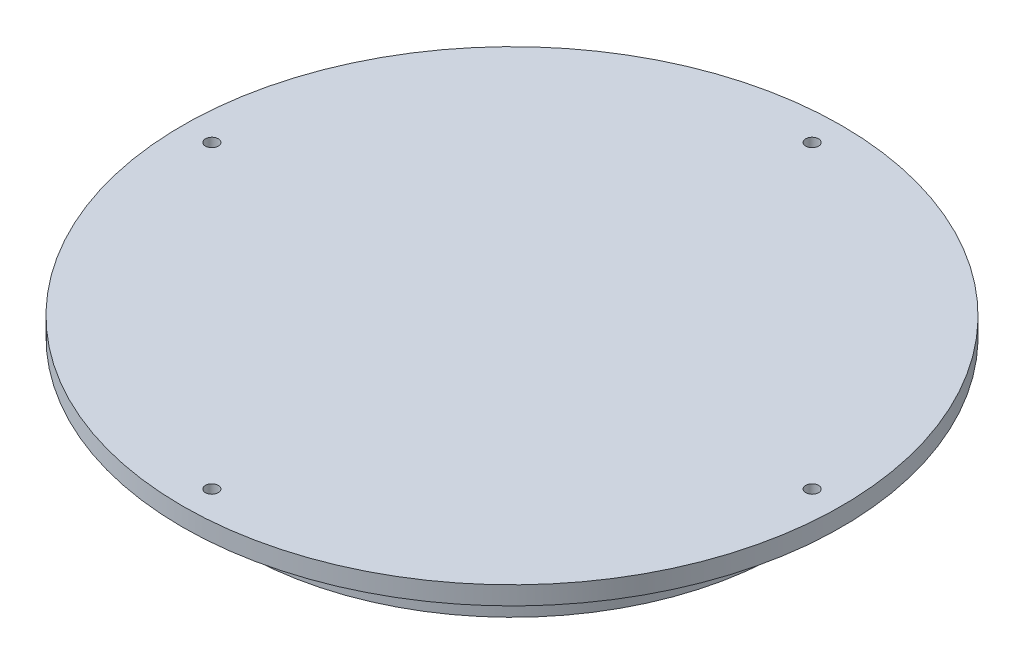
ISO-10303-21;
HEADER;
FILE_DESCRIPTION(('STEP AP214'),'2;1');
FILE_NAME('part.step','',(''),(''),'','','');
FILE_SCHEMA(('AUTOMOTIVE_DESIGN { 1 0 10303 214 1 1 1 1 }'));
ENDSEC;
DATA;
#1=APPLICATION_CONTEXT('core data for automotive mechanical design processes');
#2=APPLICATION_PROTOCOL_DEFINITION('international standard','automotive_design',2000,#1);
#3=PRODUCT_CONTEXT('',#1,'mechanical');
#4=PRODUCT('Part','Part','',(#3));
#5=PRODUCT_RELATED_PRODUCT_CATEGORY('part','',(#4));
#6=PRODUCT_DEFINITION_FORMATION('','',#4);
#7=PRODUCT_DEFINITION_CONTEXT('part definition',#1,'design');
#8=PRODUCT_DEFINITION('design','',#6,#7);
#9=PRODUCT_DEFINITION_SHAPE('','',#8);
#10=(LENGTH_UNIT() NAMED_UNIT(*) SI_UNIT(.MILLI.,.METRE.));
#11=(NAMED_UNIT(*) PLANE_ANGLE_UNIT() SI_UNIT($,.RADIAN.));
#12=(NAMED_UNIT(*) SI_UNIT($,.STERADIAN.) SOLID_ANGLE_UNIT());
#13=UNCERTAINTY_MEASURE_WITH_UNIT(LENGTH_MEASURE(1.E-05),#10,'distance_accuracy_value','');
#14=(GEOMETRIC_REPRESENTATION_CONTEXT(3) GLOBAL_UNCERTAINTY_ASSIGNED_CONTEXT((#13)) GLOBAL_UNIT_ASSIGNED_CONTEXT((#10,
#11,#12)) REPRESENTATION_CONTEXT('',''));
#15=CARTESIAN_POINT('',(0.,0.,0.));
#16=DIRECTION('',(0.,0.,1.));
#17=DIRECTION('',(1.,0.,0.));
#18=AXIS2_PLACEMENT_3D('',#15,#16,#17);
#19=CARTESIAN_POINT('',(0.,2.,63.5));
#20=DIRECTION('',(-1.,0.,0.));
#21=DIRECTION('',(0.,0.,1.));
#22=AXIS2_PLACEMENT_3D('',#19,#20,#21);
#23=CYLINDRICAL_SURFACE('',#22,2.);
#24=CARTESIAN_POINT('',(-3.,2.,63.5));
#25=DIRECTION('',(-0.707106781186547,0.707106781186547,0.));
#26=DIRECTION('',(-0.707106781186547,-0.707106781186547,0.));
#27=AXIS2_PLACEMENT_3D('',#24,#25,#26);
#28=ELLIPSE('',#27,2.82842712474619,2.);
#29=CARTESIAN_POINT('',(-5.,0.,63.5));
#30=VERTEX_POINT('',#29);
#31=CARTESIAN_POINT('',(-4.,1.,61.7679491924311));
#32=VERTEX_POINT('',#31);
#33=EDGE_CURVE('E375',#30,#32,#28,.F.);
#34=ORIENTED_EDGE('',*,*,#33,.T.);
#35=DIRECTION('',(1.,0.,0.));
#36=VECTOR('',#35,1.);
#37=CARTESIAN_POINT('',(5.,1.,61.7679491924311));
#38=LINE('',#37,#36);
#39=CARTESIAN_POINT('',(3.99999999999999,1.,61.7679491924311));
#40=VERTEX_POINT('',#39);
#41=EDGE_CURVE('E62',#32,#40,#38,.T.);
#42=ORIENTED_EDGE('',*,*,#41,.T.);
#43=CARTESIAN_POINT('',(3.,2.,63.5));
#44=DIRECTION('',(-0.707106781186547,-0.707106781186547,0.));
#45=DIRECTION('',(-0.707106781186547,0.707106781186547,0.));
#46=AXIS2_PLACEMENT_3D('',#43,#44,#45);
#47=ELLIPSE('',#46,2.82842712474619,2.);
#48=CARTESIAN_POINT('',(5.,0.,63.5));
#49=VERTEX_POINT('',#48);
#50=EDGE_CURVE('E368',#49,#40,#47,.F.);
#51=ORIENTED_EDGE('',*,*,#50,.F.);
#52=DIRECTION('',(1.,0.,0.));
#53=VECTOR('',#52,1.);
#54=CARTESIAN_POINT('',(5.,0.,63.5));
#55=LINE('',#54,#53);
#56=EDGE_CURVE('E276',#30,#49,#55,.T.);
#57=ORIENTED_EDGE('',*,*,#56,.F.);
#58=EDGE_LOOP('',(#34,#42,#51,#57));
#59=FACE_BOUND('',#58,.T.);
#60=ADVANCED_FACE('F44',(#59),#23,.T.);
#61=CARTESIAN_POINT('',(-3.,2.,63.5));
#62=DIRECTION('',(0.,-1.,0.));
#63=DIRECTION('',(0.,0.,-1.));
#64=AXIS2_PLACEMENT_3D('',#61,#62,#63);
#65=CYLINDRICAL_SURFACE('',#64,2.);
#66=CARTESIAN_POINT('',(-3.,0.,63.5));
#67=DIRECTION('',(-0.707106781186547,-0.707106781186547,0.));
#68=DIRECTION('',(0.707106781186547,-0.707106781186547,0.));
#69=AXIS2_PLACEMENT_3D('',#66,#67,#68);
#70=ELLIPSE('',#69,2.82842712474619,2.);
#71=CARTESIAN_POINT('',(-5.,2.,63.5));
#72=VERTEX_POINT('',#71);
#73=EDGE_CURVE('E358',#32,#72,#70,.F.);
#74=ORIENTED_EDGE('',*,*,#73,.F.);
#75=ORIENTED_EDGE('',*,*,#33,.F.);
#76=DIRECTION('',(0.,-1.,0.));
#77=VECTOR('',#76,1.);
#78=CARTESIAN_POINT('',(-5.,2.,63.5));
#79=LINE('',#78,#77);
#80=EDGE_CURVE('E317',#72,#30,#79,.T.);
#81=ORIENTED_EDGE('',*,*,#80,.F.);
#82=EDGE_LOOP('',(#74,#75,#81));
#83=FACE_BOUND('',#82,.T.);
#84=ADVANCED_FACE('F46',(#83),#65,.T.);
#85=CARTESIAN_POINT('',(5.,0.,63.5));
#86=DIRECTION('',(1.,0.,0.));
#87=DIRECTION('',(0.,0.,-1.));
#88=AXIS2_PLACEMENT_3D('',#85,#86,#87);
#89=CYLINDRICAL_SURFACE('',#88,2.);
#90=ORIENTED_EDGE('',*,*,#41,.F.);
#91=ORIENTED_EDGE('',*,*,#73,.T.);
#92=DIRECTION('',(1.,0.,0.));
#93=VECTOR('',#92,1.);
#94=CARTESIAN_POINT('',(0.,2.,63.5));
#95=LINE('',#94,#93);
#96=CARTESIAN_POINT('',(5.,2.,63.5));
#97=VERTEX_POINT('',#96);
#98=EDGE_CURVE('E314',#97,#72,#95,.F.);
#99=ORIENTED_EDGE('',*,*,#98,.F.);
#100=CARTESIAN_POINT('',(3.,0.,63.5));
#101=DIRECTION('',(0.707106781186547,-0.707106781186547,0.));
#102=DIRECTION('',(0.707106781186547,0.707106781186547,0.));
#103=AXIS2_PLACEMENT_3D('',#100,#101,#102);
#104=ELLIPSE('',#103,2.82842712474619,2.);
#105=EDGE_CURVE('E372',#40,#97,#104,.T.);
#106=ORIENTED_EDGE('',*,*,#105,.F.);
#107=EDGE_LOOP('',(#90,#91,#99,#106));
#108=FACE_BOUND('',#107,.T.);
#109=ADVANCED_FACE('F536',(#108),#89,.T.);
#110=CARTESIAN_POINT('',(3.,2.,63.5));
#111=DIRECTION('',(0.,-1.,0.));
#112=DIRECTION('',(0.,0.,-1.));
#113=AXIS2_PLACEMENT_3D('',#110,#111,#112);
#114=CYLINDRICAL_SURFACE('',#113,2.);
#115=ORIENTED_EDGE('',*,*,#50,.T.);
#116=ORIENTED_EDGE('',*,*,#105,.T.);
#117=DIRECTION('',(0.,-1.,0.));
#118=VECTOR('',#117,1.);
#119=CARTESIAN_POINT('',(5.,2.,63.5));
#120=LINE('',#119,#118);
#121=EDGE_CURVE('E310',#49,#97,#120,.F.);
#122=ORIENTED_EDGE('',*,*,#121,.F.);
#123=EDGE_LOOP('',(#115,#116,#122));
#124=FACE_BOUND('',#123,.T.);
#125=ADVANCED_FACE('F539',(#124),#114,.T.);
#126=CARTESIAN_POINT('',(-63.5,2.,0.));
#127=DIRECTION('',(0.,0.,-1.));
#128=DIRECTION('',(-1.,0.,0.));
#129=AXIS2_PLACEMENT_3D('',#126,#127,#128);
#130=CYLINDRICAL_SURFACE('',#129,2.);
#131=CARTESIAN_POINT('',(-63.5,2.,-3.));
#132=DIRECTION('',(0.,0.707106781186547,-0.707106781186547));
#133=DIRECTION('',(0.,-0.707106781186547,-0.707106781186547));
#134=AXIS2_PLACEMENT_3D('',#131,#132,#133);
#135=ELLIPSE('',#134,2.82842712474619,2.);
#136=CARTESIAN_POINT('',(-63.5,0.,-5.));
#137=VERTEX_POINT('',#136);
#138=CARTESIAN_POINT('',(-61.7679491924311,1.,-4.));
#139=VERTEX_POINT('',#138);
#140=EDGE_CURVE('E361',#137,#139,#135,.F.);
#141=ORIENTED_EDGE('',*,*,#140,.T.);
#142=DIRECTION('',(0.,0.,1.));
#143=VECTOR('',#142,1.);
#144=CARTESIAN_POINT('',(-61.7679491924311,1.,5.));
#145=LINE('',#144,#143);
#146=CARTESIAN_POINT('',(-61.7679491924311,1.,4.));
#147=VERTEX_POINT('',#146);
#148=EDGE_CURVE('E382',#139,#147,#145,.T.);
#149=ORIENTED_EDGE('',*,*,#148,.T.);
#150=CARTESIAN_POINT('',(-63.5,2.,3.));
#151=DIRECTION('',(0.,-0.707106781186547,-0.707106781186547));
#152=DIRECTION('',(0.,0.707106781186547,-0.707106781186547));
#153=AXIS2_PLACEMENT_3D('',#150,#151,#152);
#154=ELLIPSE('',#153,2.82842712474619,2.);
#155=CARTESIAN_POINT('',(-63.5,0.,5.));
#156=VERTEX_POINT('',#155);
#157=EDGE_CURVE('E353',#156,#147,#154,.F.);
#158=ORIENTED_EDGE('',*,*,#157,.F.);
#159=DIRECTION('',(0.,0.,1.));
#160=VECTOR('',#159,1.);
#161=CARTESIAN_POINT('',(-63.5,0.,5.));
#162=LINE('',#161,#160);
#163=EDGE_CURVE('E279',#137,#156,#162,.T.);
#164=ORIENTED_EDGE('',*,*,#163,.F.);
#165=EDGE_LOOP('',(#141,#149,#158,#164));
#166=FACE_BOUND('',#165,.T.);
#167=ADVANCED_FACE('F545',(#166),#130,.T.);
#168=CARTESIAN_POINT('',(-63.5,2.,-3.));
#169=DIRECTION('',(0.,-1.,0.));
#170=DIRECTION('',(0.,0.,-1.));
#171=AXIS2_PLACEMENT_3D('',#168,#169,#170);
#172=CYLINDRICAL_SURFACE('',#171,2.);
#173=CARTESIAN_POINT('',(-63.5,0.,-3.));
#174=DIRECTION('',(0.,-0.707106781186547,-0.707106781186547));
#175=DIRECTION('',(0.,-0.707106781186547,0.707106781186547));
#176=AXIS2_PLACEMENT_3D('',#173,#174,#175);
#177=ELLIPSE('',#176,2.82842712474619,2.);
#178=CARTESIAN_POINT('',(-63.5,2.,-5.));
#179=VERTEX_POINT('',#178);
#180=EDGE_CURVE('E343',#139,#179,#177,.F.);
#181=ORIENTED_EDGE('',*,*,#180,.F.);
#182=ORIENTED_EDGE('',*,*,#140,.F.);
#183=DIRECTION('',(0.,-1.,0.));
#184=VECTOR('',#183,1.);
#185=CARTESIAN_POINT('',(-63.5,2.,-5.));
#186=LINE('',#185,#184);
#187=EDGE_CURVE('E306',#179,#137,#186,.T.);
#188=ORIENTED_EDGE('',*,*,#187,.F.);
#189=EDGE_LOOP('',(#181,#182,#188));
#190=FACE_BOUND('',#189,.T.);
#191=ADVANCED_FACE('F550',(#190),#172,.T.);
#192=CARTESIAN_POINT('',(-63.5,0.,5.));
#193=DIRECTION('',(0.,0.,-1.));
#194=DIRECTION('',(-1.,0.,0.));
#195=AXIS2_PLACEMENT_3D('',#192,#193,#194);
#196=CYLINDRICAL_SURFACE('',#195,2.);
#197=ORIENTED_EDGE('',*,*,#148,.F.);
#198=ORIENTED_EDGE('',*,*,#180,.T.);
#199=DIRECTION('',(0.,0.,1.));
#200=VECTOR('',#199,1.);
#201=CARTESIAN_POINT('',(-63.5,2.,-5.));
#202=LINE('',#201,#200);
#203=CARTESIAN_POINT('',(-63.5,2.,5.));
#204=VERTEX_POINT('',#203);
#205=EDGE_CURVE('E303',#204,#179,#202,.F.);
#206=ORIENTED_EDGE('',*,*,#205,.F.);
#207=CARTESIAN_POINT('',(-63.5,0.,3.));
#208=DIRECTION('',(0.,0.707106781186547,-0.707106781186547));
#209=DIRECTION('',(0.,-0.707106781186547,-0.707106781186547));
#210=AXIS2_PLACEMENT_3D('',#207,#208,#209);
#211=ELLIPSE('',#210,2.82842712474619,2.);
#212=EDGE_CURVE('E357',#147,#204,#211,.F.);
#213=ORIENTED_EDGE('',*,*,#212,.F.);
#214=EDGE_LOOP('',(#197,#198,#206,#213));
#215=FACE_BOUND('',#214,.T.);
#216=ADVANCED_FACE('F602',(#215),#196,.T.);
#217=CARTESIAN_POINT('',(-63.5,2.,3.));
#218=DIRECTION('',(0.,-1.,0.));
#219=DIRECTION('',(0.,0.,-1.));
#220=AXIS2_PLACEMENT_3D('',#217,#218,#219);
#221=CYLINDRICAL_SURFACE('',#220,2.);
#222=ORIENTED_EDGE('',*,*,#157,.T.);
#223=ORIENTED_EDGE('',*,*,#212,.T.);
#224=DIRECTION('',(0.,-1.,0.));
#225=VECTOR('',#224,1.);
#226=CARTESIAN_POINT('',(-63.5,2.,5.));
#227=LINE('',#226,#225);
#228=EDGE_CURVE('E299',#156,#204,#227,.F.);
#229=ORIENTED_EDGE('',*,*,#228,.F.);
#230=EDGE_LOOP('',(#222,#223,#229));
#231=FACE_BOUND('',#230,.T.);
#232=ADVANCED_FACE('F600',(#231),#221,.T.);
#233=CARTESIAN_POINT('',(63.5,2.,0.));
#234=DIRECTION('',(0.,0.,1.));
#235=DIRECTION('',(1.,0.,0.));
#236=AXIS2_PLACEMENT_3D('',#233,#234,#235);
#237=CYLINDRICAL_SURFACE('',#236,2.);
#238=CARTESIAN_POINT('',(63.5,2.,3.00000000000001));
#239=DIRECTION('',(0.,0.707106781186547,0.707106781186547));
#240=DIRECTION('',(0.,-0.707106781186547,0.707106781186547));
#241=AXIS2_PLACEMENT_3D('',#238,#239,#240);
#242=ELLIPSE('',#241,2.82842712474619,2.);
#243=CARTESIAN_POINT('',(63.5,0.,5.00000000000001));
#244=VERTEX_POINT('',#243);
#245=CARTESIAN_POINT('',(61.7679491924311,1.,4.00000000000001));
#246=VERTEX_POINT('',#245);
#247=EDGE_CURVE('E346',#244,#246,#242,.F.);
#248=ORIENTED_EDGE('',*,*,#247,.T.);
#249=DIRECTION('',(0.,0.,-1.));
#250=VECTOR('',#249,1.);
#251=CARTESIAN_POINT('',(61.7679491924311,1.,-4.99999999999999));
#252=LINE('',#251,#250);
#253=CARTESIAN_POINT('',(61.7679491924311,1.,-3.99999999999999));
#254=VERTEX_POINT('',#253);
#255=EDGE_CURVE('E54',#246,#254,#252,.T.);
#256=ORIENTED_EDGE('',*,*,#255,.T.);
#257=CARTESIAN_POINT('',(63.5,2.,-2.99999999999999));
#258=DIRECTION('',(0.,-0.707106781186547,0.707106781186547));
#259=DIRECTION('',(0.,0.707106781186547,0.707106781186547));
#260=AXIS2_PLACEMENT_3D('',#257,#258,#259);
#261=ELLIPSE('',#260,2.82842712474619,2.);
#262=CARTESIAN_POINT('',(63.5,0.,-4.99999999999999));
#263=VERTEX_POINT('',#262);
#264=EDGE_CURVE('E338',#263,#254,#261,.F.);
#265=ORIENTED_EDGE('',*,*,#264,.F.);
#266=DIRECTION('',(0.,0.,-1.));
#267=VECTOR('',#266,1.);
#268=CARTESIAN_POINT('',(63.5,0.,-4.99999999999999));
#269=LINE('',#268,#267);
#270=EDGE_CURVE('E282',#244,#263,#269,.T.);
#271=ORIENTED_EDGE('',*,*,#270,.F.);
#272=EDGE_LOOP('',(#248,#256,#265,#271));
#273=FACE_BOUND('',#272,.T.);
#274=ADVANCED_FACE('F570',(#273),#237,.T.);
#275=CARTESIAN_POINT('',(63.5,2.,3.00000000000001));
#276=DIRECTION('',(0.,-1.,0.));
#277=DIRECTION('',(0.,0.,-1.));
#278=AXIS2_PLACEMENT_3D('',#275,#276,#277);
#279=CYLINDRICAL_SURFACE('',#278,2.);
#280=CARTESIAN_POINT('',(63.5,0.,3.00000000000001));
#281=DIRECTION('',(0.,-0.707106781186547,0.707106781186547));
#282=DIRECTION('',(0.,-0.707106781186547,-0.707106781186547));
#283=AXIS2_PLACEMENT_3D('',#280,#281,#282);
#284=ELLIPSE('',#283,2.82842712474619,2.);
#285=CARTESIAN_POINT('',(63.5,2.,5.00000000000001));
#286=VERTEX_POINT('',#285);
#287=EDGE_CURVE('E326',#246,#286,#284,.F.);
#288=ORIENTED_EDGE('',*,*,#287,.F.);
#289=ORIENTED_EDGE('',*,*,#247,.F.);
#290=DIRECTION('',(0.,-1.,0.));
#291=VECTOR('',#290,1.);
#292=CARTESIAN_POINT('',(63.5,2.,5.00000000000001));
#293=LINE('',#292,#291);
#294=EDGE_CURVE('E295',#286,#244,#293,.T.);
#295=ORIENTED_EDGE('',*,*,#294,.F.);
#296=EDGE_LOOP('',(#288,#289,#295));
#297=FACE_BOUND('',#296,.T.);
#298=ADVANCED_FACE('F586',(#297),#279,.T.);
#299=CARTESIAN_POINT('',(63.5,0.,-4.99999999999999));
#300=DIRECTION('',(0.,0.,-1.));
#301=DIRECTION('',(-1.,0.,0.));
#302=AXIS2_PLACEMENT_3D('',#299,#300,#301);
#303=CYLINDRICAL_SURFACE('',#302,2.);
#304=ORIENTED_EDGE('',*,*,#255,.F.);
#305=ORIENTED_EDGE('',*,*,#287,.T.);
#306=DIRECTION('',(0.,0.,-1.));
#307=VECTOR('',#306,1.);
#308=CARTESIAN_POINT('',(63.5,2.,0.));
#309=LINE('',#308,#307);
#310=CARTESIAN_POINT('',(63.5,2.,-4.99999999999999));
#311=VERTEX_POINT('',#310);
#312=EDGE_CURVE('E292',#311,#286,#309,.F.);
#313=ORIENTED_EDGE('',*,*,#312,.F.);
#314=CARTESIAN_POINT('',(63.5,0.,-2.99999999999999));
#315=DIRECTION('',(0.,-0.707106781186547,-0.707106781186547));
#316=DIRECTION('',(0.,0.707106781186547,-0.707106781186547));
#317=AXIS2_PLACEMENT_3D('',#314,#315,#316);
#318=ELLIPSE('',#317,2.82842712474619,2.);
#319=EDGE_CURVE('E342',#254,#311,#318,.T.);
#320=ORIENTED_EDGE('',*,*,#319,.F.);
#321=EDGE_LOOP('',(#304,#305,#313,#320));
#322=FACE_BOUND('',#321,.T.);
#323=ADVANCED_FACE('F588',(#322),#303,.T.);
#324=CARTESIAN_POINT('',(63.5,2.,-2.99999999999999));
#325=DIRECTION('',(0.,-1.,0.));
#326=DIRECTION('',(0.,0.,-1.));
#327=AXIS2_PLACEMENT_3D('',#324,#325,#326);
#328=CYLINDRICAL_SURFACE('',#327,2.);
#329=ORIENTED_EDGE('',*,*,#264,.T.);
#330=ORIENTED_EDGE('',*,*,#319,.T.);
#331=DIRECTION('',(0.,-1.,0.));
#332=VECTOR('',#331,1.);
#333=CARTESIAN_POINT('',(63.5,2.,-4.99999999999999));
#334=LINE('',#333,#332);
#335=EDGE_CURVE('E288',#263,#311,#334,.F.);
#336=ORIENTED_EDGE('',*,*,#335,.F.);
#337=EDGE_LOOP('',(#329,#330,#336));
#338=FACE_BOUND('',#337,.T.);
#339=ADVANCED_FACE('F575',(#338),#328,.T.);
#340=CARTESIAN_POINT('',(0.,2.,-63.5));
#341=DIRECTION('',(1.,0.,0.));
#342=DIRECTION('',(0.,0.,-1.));
#343=AXIS2_PLACEMENT_3D('',#340,#341,#342);
#344=CYLINDRICAL_SURFACE('',#343,2.);
#345=CARTESIAN_POINT('',(3.00000000000001,2.,-63.5));
#346=DIRECTION('',(0.707106781186547,0.707106781186547,0.));
#347=DIRECTION('',(0.707106781186547,-0.707106781186547,0.));
#348=AXIS2_PLACEMENT_3D('',#345,#346,#347);
#349=ELLIPSE('',#348,2.82842712474619,2.);
#350=CARTESIAN_POINT('',(5.00000000000001,0.,-63.5));
#351=VERTEX_POINT('',#350);
#352=CARTESIAN_POINT('',(4.00000000000001,1.,-61.7679491924311));
#353=VERTEX_POINT('',#352);
#354=EDGE_CURVE('E329',#351,#353,#349,.F.);
#355=ORIENTED_EDGE('',*,*,#354,.T.);
#356=DIRECTION('',(-1.,0.,0.));
#357=VECTOR('',#356,1.);
#358=CARTESIAN_POINT('',(-4.99999999999999,1.,-61.7679491924311));
#359=LINE('',#358,#357);
#360=CARTESIAN_POINT('',(-3.99999999999999,1.,-61.7679491924311));
#361=VERTEX_POINT('',#360);
#362=EDGE_CURVE('E11',#353,#361,#359,.T.);
#363=ORIENTED_EDGE('',*,*,#362,.T.);
#364=CARTESIAN_POINT('',(-2.99999999999999,2.,-63.5));
#365=DIRECTION('',(0.707106781186547,-0.707106781186547,0.));
#366=DIRECTION('',(0.707106781186547,0.707106781186547,0.));
#367=AXIS2_PLACEMENT_3D('',#364,#365,#366);
#368=ELLIPSE('',#367,2.82842712474619,2.);
#369=CARTESIAN_POINT('',(-4.99999999999999,0.,-63.5));
#370=VERTEX_POINT('',#369);
#371=EDGE_CURVE('E321',#370,#361,#368,.F.);
#372=ORIENTED_EDGE('',*,*,#371,.F.);
#373=DIRECTION('',(-1.,0.,0.));
#374=VECTOR('',#373,1.);
#375=CARTESIAN_POINT('',(-4.99999999999999,0.,-63.5));
#376=LINE('',#375,#374);
#377=EDGE_CURVE('E285',#351,#370,#376,.T.);
#378=ORIENTED_EDGE('',*,*,#377,.F.);
#379=EDGE_LOOP('',(#355,#363,#372,#378));
#380=FACE_BOUND('',#379,.T.);
#381=ADVANCED_FACE('F595',(#380),#344,.T.);
#382=CARTESIAN_POINT('',(3.00000000000001,2.,-63.5));
#383=DIRECTION('',(0.,-1.,0.));
#384=DIRECTION('',(0.,0.,-1.));
#385=AXIS2_PLACEMENT_3D('',#382,#383,#384);
#386=CYLINDRICAL_SURFACE('',#385,2.);
#387=CARTESIAN_POINT('',(3.00000000000001,0.,-63.5));
#388=DIRECTION('',(0.707106781186547,-0.707106781186547,0.));
#389=DIRECTION('',(-0.707106781186547,-0.707106781186547,0.));
#390=AXIS2_PLACEMENT_3D('',#387,#388,#389);
#391=ELLIPSE('',#390,2.82842712474619,2.);
#392=CARTESIAN_POINT('',(5.00000000000001,2.,-63.5));
#393=VERTEX_POINT('',#392);
#394=EDGE_CURVE('E333',#353,#393,#391,.F.);
#395=ORIENTED_EDGE('',*,*,#394,.F.);
#396=ORIENTED_EDGE('',*,*,#354,.F.);
#397=DIRECTION('',(0.,-1.,0.));
#398=VECTOR('',#397,1.);
#399=CARTESIAN_POINT('',(5.00000000000001,2.,-63.5));
#400=LINE('',#399,#398);
#401=EDGE_CURVE('E189',#393,#351,#400,.T.);
#402=ORIENTED_EDGE('',*,*,#401,.F.);
#403=EDGE_LOOP('',(#395,#396,#402));
#404=FACE_BOUND('',#403,.T.);
#405=ADVANCED_FACE('F663',(#404),#386,.T.);
#406=CARTESIAN_POINT('',(-4.99999999999999,0.,-63.5));
#407=DIRECTION('',(-1.,0.,0.));
#408=DIRECTION('',(0.,0.,1.));
#409=AXIS2_PLACEMENT_3D('',#406,#407,#408);
#410=CYLINDRICAL_SURFACE('',#409,2.);
#411=ORIENTED_EDGE('',*,*,#362,.F.);
#412=ORIENTED_EDGE('',*,*,#394,.T.);
#413=DIRECTION('',(-1.,0.,0.));
#414=VECTOR('',#413,1.);
#415=CARTESIAN_POINT('',(0.,2.,-63.5));
#416=LINE('',#415,#414);
#417=CARTESIAN_POINT('',(-4.99999999999999,2.,-63.5));
#418=VERTEX_POINT('',#417);
#419=EDGE_CURVE('E271',#418,#393,#416,.F.);
#420=ORIENTED_EDGE('',*,*,#419,.F.);
#421=CARTESIAN_POINT('',(-2.99999999999999,0.,-63.5));
#422=DIRECTION('',(-0.707106781186547,-0.707106781186547,0.));
#423=DIRECTION('',(-0.707106781186547,0.707106781186547,0.));
#424=AXIS2_PLACEMENT_3D('',#421,#422,#423);
#425=ELLIPSE('',#424,2.82842712474619,2.);
#426=EDGE_CURVE('E325',#361,#418,#425,.T.);
#427=ORIENTED_EDGE('',*,*,#426,.F.);
#428=EDGE_LOOP('',(#411,#412,#420,#427));
#429=FACE_BOUND('',#428,.T.);
#430=ADVANCED_FACE('F657',(#429),#410,.T.);
#431=CARTESIAN_POINT('',(-2.99999999999999,2.,-63.5));
#432=DIRECTION('',(0.,-1.,0.));
#433=DIRECTION('',(0.,0.,-1.));
#434=AXIS2_PLACEMENT_3D('',#431,#432,#433);
#435=CYLINDRICAL_SURFACE('',#434,2.);
#436=ORIENTED_EDGE('',*,*,#371,.T.);
#437=ORIENTED_EDGE('',*,*,#426,.T.);
#438=DIRECTION('',(0.,-1.,0.));
#439=VECTOR('',#438,1.);
#440=CARTESIAN_POINT('',(-4.99999999999999,2.,-63.5));
#441=LINE('',#440,#439);
#442=EDGE_CURVE('E208',#370,#418,#441,.F.);
#443=ORIENTED_EDGE('',*,*,#442,.F.);
#444=EDGE_LOOP('',(#436,#437,#443));
#445=FACE_BOUND('',#444,.T.);
#446=ADVANCED_FACE('F652',(#445),#435,.T.);
#447=CARTESIAN_POINT('',(0.,0.,0.));
#448=DIRECTION('',(0.,1.,0.));
#449=DIRECTION('',(0.,0.,1.));
#450=AXIS2_PLACEMENT_3D('',#447,#448,#449);
#451=PLANE('',#450);
#452=DIRECTION('',(0.,0.,1.));
#453=VECTOR('',#452,1.);
#454=CARTESIAN_POINT('',(5.00000000000001,0.,-66.5));
#455=LINE('',#454,#453);
#456=CARTESIAN_POINT('',(5.00000000000001,0.,-63.8043885637971));
#457=VERTEX_POINT('',#456);
#458=EDGE_CURVE('E182',#457,#351,#455,.T.);
#459=ORIENTED_EDGE('',*,*,#458,.T.);
#460=ORIENTED_EDGE('',*,*,#377,.T.);
#461=DIRECTION('',(0.,0.,-1.));
#462=VECTOR('',#461,1.);
#463=CARTESIAN_POINT('',(-4.99999999999999,0.,-66.5));
#464=LINE('',#463,#462);
#465=CARTESIAN_POINT('',(-4.99999999999999,0.,-63.8043885637971));
#466=VERTEX_POINT('',#465);
#467=EDGE_CURVE('E195',#370,#466,#464,.T.);
#468=ORIENTED_EDGE('',*,*,#467,.T.);
#469=CARTESIAN_POINT('',(0.,0.,0.));
#470=DIRECTION('',(0.,1.,0.));
#471=DIRECTION('',(0.,0.,1.));
#472=AXIS2_PLACEMENT_3D('',#469,#470,#471);
#473=CIRCLE('',#472,64.);
#474=CARTESIAN_POINT('',(-63.8043885637971,0.,-5.));
#475=VERTEX_POINT('',#474);
#476=EDGE_CURVE('E218',#466,#475,#473,.T.);
#477=ORIENTED_EDGE('',*,*,#476,.T.);
#478=DIRECTION('',(1.,0.,0.));
#479=VECTOR('',#478,1.);
#480=CARTESIAN_POINT('',(-66.5,0.,-5.));
#481=LINE('',#480,#479);
#482=EDGE_CURVE('E442',#475,#137,#481,.T.);
#483=ORIENTED_EDGE('',*,*,#482,.T.);
#484=ORIENTED_EDGE('',*,*,#163,.T.);
#485=DIRECTION('',(-1.,0.,0.));
#486=VECTOR('',#485,1.);
#487=CARTESIAN_POINT('',(-66.5,0.,5.));
#488=LINE('',#487,#486);
#489=CARTESIAN_POINT('',(-63.8043885637971,0.,5.));
#490=VERTEX_POINT('',#489);
#491=EDGE_CURVE('E447',#156,#490,#488,.T.);
#492=ORIENTED_EDGE('',*,*,#491,.T.);
#493=CARTESIAN_POINT('',(-5.00000000000001,0.,63.8043885637971));
#494=VERTEX_POINT('',#493);
#495=EDGE_CURVE('E224',#490,#494,#473,.T.);
#496=ORIENTED_EDGE('',*,*,#495,.T.);
#497=DIRECTION('',(0.,0.,-1.));
#498=VECTOR('',#497,1.);
#499=CARTESIAN_POINT('',(-5.00000000000001,0.,66.5));
#500=LINE('',#499,#498);
#501=EDGE_CURVE('E450',#494,#30,#500,.T.);
#502=ORIENTED_EDGE('',*,*,#501,.T.);
#503=ORIENTED_EDGE('',*,*,#56,.T.);
#504=DIRECTION('',(0.,0.,1.));
#505=VECTOR('',#504,1.);
#506=CARTESIAN_POINT('',(4.99999999999999,0.,66.5));
#507=LINE('',#506,#505);
#508=CARTESIAN_POINT('',(4.99999999999999,0.,63.8043885637971));
#509=VERTEX_POINT('',#508);
#510=EDGE_CURVE('E460',#49,#509,#507,.T.);
#511=ORIENTED_EDGE('',*,*,#510,.T.);
#512=CARTESIAN_POINT('',(63.8043885637971,0.,5.00000000000001));
#513=VERTEX_POINT('',#512);
#514=EDGE_CURVE('E217',#509,#513,#473,.T.);
#515=ORIENTED_EDGE('',*,*,#514,.T.);
#516=DIRECTION('',(-1.,0.,0.));
#517=VECTOR('',#516,1.);
#518=CARTESIAN_POINT('',(66.5,0.,5.00000000000001));
#519=LINE('',#518,#517);
#520=EDGE_CURVE('E464',#513,#244,#519,.T.);
#521=ORIENTED_EDGE('',*,*,#520,.T.);
#522=ORIENTED_EDGE('',*,*,#270,.T.);
#523=DIRECTION('',(1.,0.,0.));
#524=VECTOR('',#523,1.);
#525=CARTESIAN_POINT('',(66.5,0.,-4.99999999999999));
#526=LINE('',#525,#524);
#527=CARTESIAN_POINT('',(63.8043885637971,0.,-4.99999999999999));
#528=VERTEX_POINT('',#527);
#529=EDGE_CURVE('E214',#263,#528,#526,.T.);
#530=ORIENTED_EDGE('',*,*,#529,.T.);
#531=EDGE_CURVE('E203',#528,#457,#473,.T.);
#532=ORIENTED_EDGE('',*,*,#531,.T.);
#533=EDGE_LOOP('',(#459,#460,#468,#477,#483,#484,#492,#496,#502,#503,#511,#515,#521,#522,#530,#532));
#534=FACE_BOUND('',#533,.T.);
#535=CARTESIAN_POINT('',(0.,0.,0.));
#536=DIRECTION('',(0.,-1.,0.));
#537=DIRECTION('',(0.,0.,-1.));
#538=AXIS2_PLACEMENT_3D('',#535,#536,#537);
#539=CIRCLE('',#538,74.);
#540=CARTESIAN_POINT('',(0.,0.,-74.));
#541=VERTEX_POINT('',#540);
#542=EDGE_CURVE('E434',#541,#541,#539,.T.);
#543=ORIENTED_EDGE('',*,*,#542,.T.);
#544=EDGE_LOOP('',(#543));
#545=FACE_BOUND('',#544,.T.);
#546=ADVANCED_FACE('F211',(#534,#545),#451,.F.);
#547=CARTESIAN_POINT('',(0.,18.,0.));
#548=DIRECTION('',(0.,-1.,0.));
#549=DIRECTION('',(0.,0.,-1.));
#550=AXIS2_PLACEMENT_3D('',#547,#548,#549);
#551=CYLINDRICAL_SURFACE('',#550,64.);
#552=DIRECTION('',(0.,-1.,0.));
#553=VECTOR('',#552,1.);
#554=CARTESIAN_POINT('',(5.00000000000001,18.,-63.8043885637971));
#555=LINE('',#554,#553);
#556=CARTESIAN_POINT('',(5.00000000000001,2.,-63.8043885637971));
#557=VERTEX_POINT('',#556);
#558=EDGE_CURVE('E186',#457,#557,#555,.F.);
#559=ORIENTED_EDGE('',*,*,#558,.F.);
#560=ORIENTED_EDGE('',*,*,#531,.F.);
#561=DIRECTION('',(0.,-1.,0.));
#562=VECTOR('',#561,1.);
#563=CARTESIAN_POINT('',(63.8043885637971,18.,-4.99999999999999));
#564=LINE('',#563,#562);
#565=CARTESIAN_POINT('',(63.8043885637971,2.,-4.99999999999999));
#566=VERTEX_POINT('',#565);
#567=EDGE_CURVE('E257',#566,#528,#564,.T.);
#568=ORIENTED_EDGE('',*,*,#567,.F.);
#569=CARTESIAN_POINT('',(0.,2.,0.));
#570=DIRECTION('',(0.,1.,0.));
#571=DIRECTION('',(0.,0.,1.));
#572=AXIS2_PLACEMENT_3D('',#569,#570,#571);
#573=CIRCLE('',#572,64.);
#574=CARTESIAN_POINT('',(63.8043885637971,2.,5.00000000000001));
#575=VERTEX_POINT('',#574);
#576=EDGE_CURVE('E253',#575,#566,#573,.T.);
#577=ORIENTED_EDGE('',*,*,#576,.F.);
#578=DIRECTION('',(0.,-1.,0.));
#579=VECTOR('',#578,1.);
#580=CARTESIAN_POINT('',(63.8043885637971,18.,5.00000000000001));
#581=LINE('',#580,#579);
#582=EDGE_CURVE('E260',#513,#575,#581,.F.);
#583=ORIENTED_EDGE('',*,*,#582,.F.);
#584=ORIENTED_EDGE('',*,*,#514,.F.);
#585=DIRECTION('',(0.,-1.,0.));
#586=VECTOR('',#585,1.);
#587=CARTESIAN_POINT('',(4.99999999999999,18.,63.8043885637971));
#588=LINE('',#587,#586);
#589=CARTESIAN_POINT('',(4.99999999999999,2.,63.8043885637971));
#590=VERTEX_POINT('',#589);
#591=EDGE_CURVE('E246',#590,#509,#588,.T.);
#592=ORIENTED_EDGE('',*,*,#591,.F.);
#593=CARTESIAN_POINT('',(0.,2.,0.));
#594=DIRECTION('',(0.,1.,0.));
#595=DIRECTION('',(0.,0.,1.));
#596=AXIS2_PLACEMENT_3D('',#593,#594,#595);
#597=CIRCLE('',#596,64.);
#598=CARTESIAN_POINT('',(-5.00000000000001,2.,63.8043885637971));
#599=VERTEX_POINT('',#598);
#600=EDGE_CURVE('E242',#599,#590,#597,.T.);
#601=ORIENTED_EDGE('',*,*,#600,.F.);
#602=DIRECTION('',(0.,-1.,0.));
#603=VECTOR('',#602,1.);
#604=CARTESIAN_POINT('',(-5.00000000000001,18.,63.8043885637971));
#605=LINE('',#604,#603);
#606=EDGE_CURVE('E250',#494,#599,#605,.F.);
#607=ORIENTED_EDGE('',*,*,#606,.F.);
#608=ORIENTED_EDGE('',*,*,#495,.F.);
#609=DIRECTION('',(0.,-1.,0.));
#610=VECTOR('',#609,1.);
#611=CARTESIAN_POINT('',(-63.8043885637971,18.,5.));
#612=LINE('',#611,#610);
#613=CARTESIAN_POINT('',(-63.8043885637971,2.,5.));
#614=VERTEX_POINT('',#613);
#615=EDGE_CURVE('E235',#614,#490,#612,.T.);
#616=ORIENTED_EDGE('',*,*,#615,.F.);
#617=CARTESIAN_POINT('',(0.,2.,0.));
#618=DIRECTION('',(0.,-1.,0.));
#619=DIRECTION('',(0.,0.,-1.));
#620=AXIS2_PLACEMENT_3D('',#617,#618,#619);
#621=CIRCLE('',#620,64.);
#622=CARTESIAN_POINT('',(-63.8043885637971,2.,-5.));
#623=VERTEX_POINT('',#622);
#624=EDGE_CURVE('E230',#614,#623,#621,.T.);
#625=ORIENTED_EDGE('',*,*,#624,.T.);
#626=DIRECTION('',(0.,-1.,0.));
#627=VECTOR('',#626,1.);
#628=CARTESIAN_POINT('',(-63.8043885637971,18.,-5.));
#629=LINE('',#628,#627);
#630=EDGE_CURVE('E239',#475,#623,#629,.F.);
#631=ORIENTED_EDGE('',*,*,#630,.F.);
#632=ORIENTED_EDGE('',*,*,#476,.F.);
#633=DIRECTION('',(0.,-1.,0.));
#634=VECTOR('',#633,1.);
#635=CARTESIAN_POINT('',(-4.99999999999999,18.,-63.8043885637971));
#636=LINE('',#635,#634);
#637=CARTESIAN_POINT('',(-4.99999999999999,2.,-63.8043885637971));
#638=VERTEX_POINT('',#637);
#639=EDGE_CURVE('E209',#638,#466,#636,.T.);
#640=ORIENTED_EDGE('',*,*,#639,.F.);
#641=CARTESIAN_POINT('',(0.,2.,0.));
#642=DIRECTION('',(0.,1.,0.));
#643=DIRECTION('',(0.,0.,1.));
#644=AXIS2_PLACEMENT_3D('',#641,#642,#643);
#645=CIRCLE('',#644,64.);
#646=EDGE_CURVE('E206',#557,#638,#645,.T.);
#647=ORIENTED_EDGE('',*,*,#646,.F.);
#648=EDGE_LOOP('',(#559,#560,#568,#577,#583,#584,#592,#601,#607,#608,#616,#625,#631,#632,#640,#647));
#649=FACE_BOUND('',#648,.T.);
#650=CARTESIAN_POINT('',(0.,18.,0.));
#651=DIRECTION('',(0.,1.,0.));
#652=DIRECTION('',(0.,0.,1.));
#653=AXIS2_PLACEMENT_3D('',#650,#651,#652);
#654=CIRCLE('',#653,64.);
#655=CARTESIAN_POINT('',(0.,18.,64.));
#656=VERTEX_POINT('',#655);
#657=EDGE_CURVE('E225',#656,#656,#654,.T.);
#658=ORIENTED_EDGE('',*,*,#657,.T.);
#659=EDGE_LOOP('',(#658));
#660=FACE_BOUND('',#659,.T.);
#661=ADVANCED_FACE('F200',(#649,#660),#551,.F.);
#662=CARTESIAN_POINT('',(0.,18.,0.));
#663=DIRECTION('',(0.,1.,0.));
#664=DIRECTION('',(0.,0.,1.));
#665=AXIS2_PLACEMENT_3D('',#662,#663,#664);
#666=PLANE('',#665);
#667=ORIENTED_EDGE('',*,*,#657,.F.);
#668=EDGE_LOOP('',(#667));
#669=FACE_BOUND('',#668,.T.);
#670=ADVANCED_FACE('F508',(#669),#666,.F.);
#671=CARTESIAN_POINT('',(0.,14.,0.));
#672=DIRECTION('',(0.,-1.,0.));
#673=DIRECTION('',(0.,0.,-1.));
#674=AXIS2_PLACEMENT_3D('',#671,#672,#673);
#675=PLANE('',#674);
#676=CARTESIAN_POINT('',(0.,14.,81.9693458494063));
#677=DIRECTION('',(0.,-1.,0.));
#678=DIRECTION('',(0.,0.,-1.));
#679=AXIS2_PLACEMENT_3D('',#676,#677,#678);
#680=CIRCLE('',#679,1.75);
#681=CARTESIAN_POINT('',(0.,14.,80.2193458494063));
#682=VERTEX_POINT('',#681);
#683=EDGE_CURVE('E392',#682,#682,#680,.T.);
#684=ORIENTED_EDGE('',*,*,#683,.F.);
#685=EDGE_LOOP('',(#684));
#686=FACE_BOUND('',#685,.T.);
#687=CARTESIAN_POINT('',(81.9693458494086,14.,2.31465140537872E-12));
#688=DIRECTION('',(0.,-1.,0.));
#689=DIRECTION('',(0.,0.,-1.));
#690=AXIS2_PLACEMENT_3D('',#687,#688,#689);
#691=CIRCLE('',#690,1.75000000000181);
#692=CARTESIAN_POINT('',(81.9693458494086,14.,-1.74999999999949));
#693=VERTEX_POINT('',#692);
#694=EDGE_CURVE('E496',#693,#693,#691,.T.);
#695=ORIENTED_EDGE('',*,*,#694,.F.);
#696=EDGE_LOOP('',(#695));
#697=FACE_BOUND('',#696,.T.);
#698=CARTESIAN_POINT('',(4.62930281075743E-12,14.,-81.9693458494063));
#699=DIRECTION('',(0.,-1.,0.));
#700=DIRECTION('',(0.,0.,-1.));
#701=AXIS2_PLACEMENT_3D('',#698,#699,#700);
#702=CIRCLE('',#701,1.75000000000497);
#703=CARTESIAN_POINT('',(4.62930281075743E-12,14.,-83.7193458494112));
#704=VERTEX_POINT('',#703);
#705=EDGE_CURVE('E492',#704,#704,#702,.T.);
#706=ORIENTED_EDGE('',*,*,#705,.F.);
#707=EDGE_LOOP('',(#706));
#708=FACE_BOUND('',#707,.T.);
#709=CARTESIAN_POINT('',(-81.969345849404,14.,-2.32468975508098E-12));
#710=DIRECTION('',(0.,-1.,0.));
#711=DIRECTION('',(0.,0.,-1.));
#712=AXIS2_PLACEMENT_3D('',#709,#710,#711);
#713=CIRCLE('',#712,1.75000000000372);
#714=CARTESIAN_POINT('',(-81.969345849404,14.,-1.75000000000604));
#715=VERTEX_POINT('',#714);
#716=EDGE_CURVE('E488',#715,#715,#713,.T.);
#717=ORIENTED_EDGE('',*,*,#716,.F.);
#718=EDGE_LOOP('',(#717));
#719=FACE_BOUND('',#718,.T.);
#720=CARTESIAN_POINT('',(0.,14.,0.));
#721=DIRECTION('',(0.,-1.,0.));
#722=DIRECTION('',(0.,0.,-1.));
#723=AXIS2_PLACEMENT_3D('',#720,#721,#722);
#724=CIRCLE('',#723,74.);
#725=CARTESIAN_POINT('',(0.,14.,-74.));
#726=VERTEX_POINT('',#725);
#727=EDGE_CURVE('E431',#726,#726,#724,.T.);
#728=ORIENTED_EDGE('',*,*,#727,.F.);
#729=EDGE_LOOP('',(#728));
#730=FACE_BOUND('',#729,.T.);
#731=CARTESIAN_POINT('',(0.,14.,0.));
#732=DIRECTION('',(0.,-1.,0.));
#733=DIRECTION('',(0.,0.,-1.));
#734=AXIS2_PLACEMENT_3D('',#731,#732,#733);
#735=CIRCLE('',#734,90.);
#736=CARTESIAN_POINT('',(0.,14.,-90.));
#737=VERTEX_POINT('',#736);
#738=EDGE_CURVE('E425',#737,#737,#735,.T.);
#739=ORIENTED_EDGE('',*,*,#738,.T.);
#740=EDGE_LOOP('',(#739));
#741=FACE_BOUND('',#740,.T.);
#742=ADVANCED_FACE('F505',(#686,#697,#708,#719,#730,#741),#675,.T.);
#743=CARTESIAN_POINT('',(0.,14.,0.));
#744=DIRECTION('',(0.,-1.,0.));
#745=DIRECTION('',(0.,0.,-1.));
#746=AXIS2_PLACEMENT_3D('',#743,#744,#745);
#747=CYLINDRICAL_SURFACE('',#746,74.);
#748=ORIENTED_EDGE('',*,*,#727,.T.);
#749=EDGE_LOOP('',(#748));
#750=FACE_BOUND('',#749,.T.);
#751=ORIENTED_EDGE('',*,*,#542,.F.);
#752=EDGE_LOOP('',(#751));
#753=FACE_BOUND('',#752,.T.);
#754=ADVANCED_FACE('F413',(#750,#753),#747,.T.);
#755=CARTESIAN_POINT('',(0.,19.,0.));
#756=DIRECTION('',(0.,1.,0.));
#757=DIRECTION('',(0.,0.,1.));
#758=AXIS2_PLACEMENT_3D('',#755,#756,#757);
#759=PLANE('',#758);
#760=CARTESIAN_POINT('',(0.,19.,81.9693458494063));
#761=DIRECTION('',(0.,1.,0.));
#762=DIRECTION('',(0.,0.,1.));
#763=AXIS2_PLACEMENT_3D('',#760,#761,#762);
#764=CIRCLE('',#763,1.75);
#765=CARTESIAN_POINT('',(0.,19.,83.7193458494063));
#766=VERTEX_POINT('',#765);
#767=EDGE_CURVE('E48',#766,#766,#764,.T.);
#768=ORIENTED_EDGE('',*,*,#767,.F.);
#769=EDGE_LOOP('',(#768));
#770=FACE_BOUND('',#769,.T.);
#771=CARTESIAN_POINT('',(81.9693458494086,19.,2.31465140537872E-12));
#772=DIRECTION('',(0.,1.,0.));
#773=DIRECTION('',(0.,0.,1.));
#774=AXIS2_PLACEMENT_3D('',#771,#772,#773);
#775=CIRCLE('',#774,1.75000000000181);
#776=CARTESIAN_POINT('',(81.9693458494086,19.,1.75000000000412));
#777=VERTEX_POINT('',#776);
#778=EDGE_CURVE('E395',#777,#777,#775,.T.);
#779=ORIENTED_EDGE('',*,*,#778,.F.);
#780=EDGE_LOOP('',(#779));
#781=FACE_BOUND('',#780,.T.);
#782=CARTESIAN_POINT('',(4.62930281075743E-12,19.,-81.9693458494063));
#783=DIRECTION('',(0.,1.,0.));
#784=DIRECTION('',(0.,0.,1.));
#785=AXIS2_PLACEMENT_3D('',#782,#783,#784);
#786=CIRCLE('',#785,1.75000000000497);
#787=CARTESIAN_POINT('',(4.62930281075743E-12,19.,-80.2193458494013));
#788=VERTEX_POINT('',#787);
#789=EDGE_CURVE('E391',#788,#788,#786,.T.);
#790=ORIENTED_EDGE('',*,*,#789,.F.);
#791=EDGE_LOOP('',(#790));
#792=FACE_BOUND('',#791,.T.);
#793=CARTESIAN_POINT('',(-81.969345849404,19.,-2.32468975508098E-12));
#794=DIRECTION('',(0.,1.,0.));
#795=DIRECTION('',(0.,0.,1.));
#796=AXIS2_PLACEMENT_3D('',#793,#794,#795);
#797=CIRCLE('',#796,1.75000000000372);
#798=CARTESIAN_POINT('',(-81.969345849404,19.,1.75000000000139));
#799=VERTEX_POINT('',#798);
#800=EDGE_CURVE('E387',#799,#799,#797,.T.);
#801=ORIENTED_EDGE('',*,*,#800,.F.);
#802=EDGE_LOOP('',(#801));
#803=FACE_BOUND('',#802,.T.);
#804=CARTESIAN_POINT('',(0.,19.,0.));
#805=DIRECTION('',(0.,1.,0.));
#806=DIRECTION('',(0.,0.,1.));
#807=AXIS2_PLACEMENT_3D('',#804,#805,#806);
#808=CIRCLE('',#807,90.);
#809=CARTESIAN_POINT('',(0.,19.,90.));
#810=VERTEX_POINT('',#809);
#811=EDGE_CURVE('E422',#810,#810,#808,.T.);
#812=ORIENTED_EDGE('',*,*,#811,.T.);
#813=EDGE_LOOP('',(#812));
#814=FACE_BOUND('',#813,.T.);
#815=ADVANCED_FACE('F409',(#770,#781,#792,#803,#814),#759,.T.);
#816=CARTESIAN_POINT('',(0.,18.,0.));
#817=DIRECTION('',(0.,-1.,0.));
#818=DIRECTION('',(0.,0.,-1.));
#819=AXIS2_PLACEMENT_3D('',#816,#817,#818);
#820=CYLINDRICAL_SURFACE('',#819,90.);
#821=ORIENTED_EDGE('',*,*,#811,.F.);
#822=EDGE_LOOP('',(#821));
#823=FACE_BOUND('',#822,.T.);
#824=ORIENTED_EDGE('',*,*,#738,.F.);
#825=EDGE_LOOP('',(#824));
#826=FACE_BOUND('',#825,.T.);
#827=ADVANCED_FACE('F412',(#823,#826),#820,.T.);
#828=CARTESIAN_POINT('',(0.,2.,0.));
#829=DIRECTION('',(0.,-1.,0.));
#830=DIRECTION('',(0.,0.,-1.));
#831=AXIS2_PLACEMENT_3D('',#828,#829,#830);
#832=PLANE('',#831);
#833=DIRECTION('',(-1.,0.,0.));
#834=VECTOR('',#833,1.);
#835=CARTESIAN_POINT('',(-66.5,2.,5.));
#836=LINE('',#835,#834);
#837=EDGE_CURVE('E446',#204,#614,#836,.T.);
#838=ORIENTED_EDGE('',*,*,#837,.F.);
#839=ORIENTED_EDGE('',*,*,#205,.T.);
#840=DIRECTION('',(1.,0.,0.));
#841=VECTOR('',#840,1.);
#842=CARTESIAN_POINT('',(-66.5,2.,-5.));
#843=LINE('',#842,#841);
#844=EDGE_CURVE('E438',#623,#179,#843,.T.);
#845=ORIENTED_EDGE('',*,*,#844,.F.);
#846=ORIENTED_EDGE('',*,*,#624,.F.);
#847=EDGE_LOOP('',(#838,#839,#845,#846));
#848=FACE_BOUND('',#847,.T.);
#849=ADVANCED_FACE('F521',(#848),#832,.F.);
#850=CARTESIAN_POINT('',(-66.5,2.,-5.));
#851=DIRECTION('',(0.,0.,-1.));
#852=DIRECTION('',(-1.,0.,0.));
#853=AXIS2_PLACEMENT_3D('',#850,#851,#852);
#854=PLANE('',#853);
#855=ORIENTED_EDGE('',*,*,#844,.T.);
#856=ORIENTED_EDGE('',*,*,#187,.T.);
#857=ORIENTED_EDGE('',*,*,#482,.F.);
#858=ORIENTED_EDGE('',*,*,#630,.T.);
#859=EDGE_LOOP('',(#855,#856,#857,#858));
#860=FACE_BOUND('',#859,.T.);
#861=ADVANCED_FACE('F526',(#860),#854,.T.);
#862=CARTESIAN_POINT('',(-66.5,2.,5.));
#863=DIRECTION('',(0.,0.,1.));
#864=DIRECTION('',(1.,0.,0.));
#865=AXIS2_PLACEMENT_3D('',#862,#863,#864);
#866=PLANE('',#865);
#867=ORIENTED_EDGE('',*,*,#491,.F.);
#868=ORIENTED_EDGE('',*,*,#228,.T.);
#869=ORIENTED_EDGE('',*,*,#837,.T.);
#870=ORIENTED_EDGE('',*,*,#615,.T.);
#871=EDGE_LOOP('',(#867,#868,#869,#870));
#872=FACE_BOUND('',#871,.T.);
#873=ADVANCED_FACE('F621',(#872),#866,.T.);
#874=CARTESIAN_POINT('',(0.,2.,0.));
#875=DIRECTION('',(0.,1.,0.));
#876=DIRECTION('',(0.,0.,1.));
#877=AXIS2_PLACEMENT_3D('',#874,#875,#876);
#878=PLANE('',#877);
#879=DIRECTION('',(0.,0.,1.));
#880=VECTOR('',#879,1.);
#881=CARTESIAN_POINT('',(4.99999999999999,2.,66.5));
#882=LINE('',#881,#880);
#883=EDGE_CURVE('E461',#97,#590,#882,.T.);
#884=ORIENTED_EDGE('',*,*,#883,.F.);
#885=ORIENTED_EDGE('',*,*,#98,.T.);
#886=DIRECTION('',(0.,0.,-1.));
#887=VECTOR('',#886,1.);
#888=CARTESIAN_POINT('',(-5.00000000000001,2.,66.5));
#889=LINE('',#888,#887);
#890=EDGE_CURVE('E456',#599,#72,#889,.T.);
#891=ORIENTED_EDGE('',*,*,#890,.F.);
#892=ORIENTED_EDGE('',*,*,#600,.T.);
#893=EDGE_LOOP('',(#884,#885,#891,#892));
#894=FACE_BOUND('',#893,.T.);
#895=ADVANCED_FACE('F632',(#894),#878,.T.);
#896=CARTESIAN_POINT('',(-5.00000000000001,2.,66.5));
#897=DIRECTION('',(-1.,0.,0.));
#898=DIRECTION('',(0.,0.,1.));
#899=AXIS2_PLACEMENT_3D('',#896,#897,#898);
#900=PLANE('',#899);
#901=ORIENTED_EDGE('',*,*,#890,.T.);
#902=ORIENTED_EDGE('',*,*,#80,.T.);
#903=ORIENTED_EDGE('',*,*,#501,.F.);
#904=ORIENTED_EDGE('',*,*,#606,.T.);
#905=EDGE_LOOP('',(#901,#902,#903,#904));
#906=FACE_BOUND('',#905,.T.);
#907=ADVANCED_FACE('F629',(#906),#900,.T.);
#908=CARTESIAN_POINT('',(4.99999999999999,2.,66.5));
#909=DIRECTION('',(1.,0.,0.));
#910=DIRECTION('',(0.,0.,-1.));
#911=AXIS2_PLACEMENT_3D('',#908,#909,#910);
#912=PLANE('',#911);
#913=ORIENTED_EDGE('',*,*,#510,.F.);
#914=ORIENTED_EDGE('',*,*,#121,.T.);
#915=ORIENTED_EDGE('',*,*,#883,.T.);
#916=ORIENTED_EDGE('',*,*,#591,.T.);
#917=EDGE_LOOP('',(#913,#914,#915,#916));
#918=FACE_BOUND('',#917,.T.);
#919=ADVANCED_FACE('F559',(#918),#912,.T.);
#920=CARTESIAN_POINT('',(0.,2.,0.));
#921=DIRECTION('',(0.,1.,0.));
#922=DIRECTION('',(0.,0.,1.));
#923=AXIS2_PLACEMENT_3D('',#920,#921,#922);
#924=PLANE('',#923);
#925=DIRECTION('',(1.,0.,0.));
#926=VECTOR('',#925,1.);
#927=CARTESIAN_POINT('',(66.5,2.,-4.99999999999999));
#928=LINE('',#927,#926);
#929=EDGE_CURVE('E194',#311,#566,#928,.T.);
#930=ORIENTED_EDGE('',*,*,#929,.F.);
#931=ORIENTED_EDGE('',*,*,#312,.T.);
#932=DIRECTION('',(-1.,0.,0.));
#933=VECTOR('',#932,1.);
#934=CARTESIAN_POINT('',(66.5,2.,5.00000000000001));
#935=LINE('',#934,#933);
#936=EDGE_CURVE('E470',#575,#286,#935,.T.);
#937=ORIENTED_EDGE('',*,*,#936,.F.);
#938=ORIENTED_EDGE('',*,*,#576,.T.);
#939=EDGE_LOOP('',(#930,#931,#937,#938));
#940=FACE_BOUND('',#939,.T.);
#941=ADVANCED_FACE('F581',(#940),#924,.T.);
#942=CARTESIAN_POINT('',(66.5,2.,5.00000000000001));
#943=DIRECTION('',(0.,0.,1.));
#944=DIRECTION('',(1.,0.,0.));
#945=AXIS2_PLACEMENT_3D('',#942,#943,#944);
#946=PLANE('',#945);
#947=ORIENTED_EDGE('',*,*,#936,.T.);
#948=ORIENTED_EDGE('',*,*,#294,.T.);
#949=ORIENTED_EDGE('',*,*,#520,.F.);
#950=ORIENTED_EDGE('',*,*,#582,.T.);
#951=EDGE_LOOP('',(#947,#948,#949,#950));
#952=FACE_BOUND('',#951,.T.);
#953=ADVANCED_FACE('F584',(#952),#946,.T.);
#954=CARTESIAN_POINT('',(66.5,2.,-4.99999999999999));
#955=DIRECTION('',(0.,0.,-1.));
#956=DIRECTION('',(-1.,0.,0.));
#957=AXIS2_PLACEMENT_3D('',#954,#955,#956);
#958=PLANE('',#957);
#959=ORIENTED_EDGE('',*,*,#529,.F.);
#960=ORIENTED_EDGE('',*,*,#335,.T.);
#961=ORIENTED_EDGE('',*,*,#929,.T.);
#962=ORIENTED_EDGE('',*,*,#567,.T.);
#963=EDGE_LOOP('',(#959,#960,#961,#962));
#964=FACE_BOUND('',#963,.T.);
#965=ADVANCED_FACE('F579',(#964),#958,.T.);
#966=CARTESIAN_POINT('',(0.,2.,0.));
#967=DIRECTION('',(0.,1.,0.));
#968=DIRECTION('',(0.,0.,1.));
#969=AXIS2_PLACEMENT_3D('',#966,#967,#968);
#970=PLANE('',#969);
#971=DIRECTION('',(0.,0.,-1.));
#972=VECTOR('',#971,1.);
#973=CARTESIAN_POINT('',(-4.99999999999999,2.,-66.5));
#974=LINE('',#973,#972);
#975=EDGE_CURVE('E337',#418,#638,#974,.T.);
#976=ORIENTED_EDGE('',*,*,#975,.F.);
#977=ORIENTED_EDGE('',*,*,#419,.T.);
#978=DIRECTION('',(0.,0.,1.));
#979=VECTOR('',#978,1.);
#980=CARTESIAN_POINT('',(5.00000000000001,2.,-66.5));
#981=LINE('',#980,#979);
#982=EDGE_CURVE('E481',#557,#393,#981,.T.);
#983=ORIENTED_EDGE('',*,*,#982,.F.);
#984=ORIENTED_EDGE('',*,*,#646,.T.);
#985=EDGE_LOOP('',(#976,#977,#983,#984));
#986=FACE_BOUND('',#985,.T.);
#987=ADVANCED_FACE('F687',(#986),#970,.T.);
#988=CARTESIAN_POINT('',(5.00000000000001,2.,-66.5));
#989=DIRECTION('',(1.,0.,0.));
#990=DIRECTION('',(0.,0.,-1.));
#991=AXIS2_PLACEMENT_3D('',#988,#989,#990);
#992=PLANE('',#991);
#993=ORIENTED_EDGE('',*,*,#982,.T.);
#994=ORIENTED_EDGE('',*,*,#401,.T.);
#995=ORIENTED_EDGE('',*,*,#458,.F.);
#996=ORIENTED_EDGE('',*,*,#558,.T.);
#997=EDGE_LOOP('',(#993,#994,#995,#996));
#998=FACE_BOUND('',#997,.T.);
#999=ADVANCED_FACE('F185',(#998),#992,.T.);
#1000=CARTESIAN_POINT('',(-4.99999999999999,2.,-66.5));
#1001=DIRECTION('',(-1.,0.,0.));
#1002=DIRECTION('',(0.,0.,1.));
#1003=AXIS2_PLACEMENT_3D('',#1000,#1001,#1002);
#1004=PLANE('',#1003);
#1005=ORIENTED_EDGE('',*,*,#467,.F.);
#1006=ORIENTED_EDGE('',*,*,#442,.T.);
#1007=ORIENTED_EDGE('',*,*,#975,.T.);
#1008=ORIENTED_EDGE('',*,*,#639,.T.);
#1009=EDGE_LOOP('',(#1005,#1006,#1007,#1008));
#1010=FACE_BOUND('',#1009,.T.);
#1011=ADVANCED_FACE('F681',(#1010),#1004,.T.);
#1012=CARTESIAN_POINT('',(-81.969345849404,89.,-2.32468975508098E-12));
#1013=DIRECTION('',(0.,-1.,0.));
#1014=DIRECTION('',(0.,0.,-1.));
#1015=AXIS2_PLACEMENT_3D('',#1012,#1013,#1014);
#1016=CYLINDRICAL_SURFACE('',#1015,1.75000000000372);
#1017=ORIENTED_EDGE('',*,*,#800,.T.);
#1018=EDGE_LOOP('',(#1017));
#1019=FACE_BOUND('',#1018,.T.);
#1020=ORIENTED_EDGE('',*,*,#716,.T.);
#1021=EDGE_LOOP('',(#1020));
#1022=FACE_BOUND('',#1021,.T.);
#1023=ADVANCED_FACE('F894',(#1019,#1022),#1016,.F.);
#1024=CARTESIAN_POINT('',(4.62930281075743E-12,89.,-81.9693458494063));
#1025=DIRECTION('',(0.,-1.,0.));
#1026=DIRECTION('',(0.,0.,-1.));
#1027=AXIS2_PLACEMENT_3D('',#1024,#1025,#1026);
#1028=CYLINDRICAL_SURFACE('',#1027,1.75000000000497);
#1029=ORIENTED_EDGE('',*,*,#789,.T.);
#1030=EDGE_LOOP('',(#1029));
#1031=FACE_BOUND('',#1030,.T.);
#1032=ORIENTED_EDGE('',*,*,#705,.T.);
#1033=EDGE_LOOP('',(#1032));
#1034=FACE_BOUND('',#1033,.T.);
#1035=ADVANCED_FACE('F898',(#1031,#1034),#1028,.F.);
#1036=CARTESIAN_POINT('',(81.9693458494086,89.,2.31465140537872E-12));
#1037=DIRECTION('',(0.,-1.,0.));
#1038=DIRECTION('',(0.,0.,-1.));
#1039=AXIS2_PLACEMENT_3D('',#1036,#1037,#1038);
#1040=CYLINDRICAL_SURFACE('',#1039,1.75000000000181);
#1041=ORIENTED_EDGE('',*,*,#778,.T.);
#1042=EDGE_LOOP('',(#1041));
#1043=FACE_BOUND('',#1042,.T.);
#1044=ORIENTED_EDGE('',*,*,#694,.T.);
#1045=EDGE_LOOP('',(#1044));
#1046=FACE_BOUND('',#1045,.T.);
#1047=ADVANCED_FACE('F909',(#1043,#1046),#1040,.F.);
#1048=CARTESIAN_POINT('',(0.,89.,81.9693458494063));
#1049=DIRECTION('',(0.,-1.,0.));
#1050=DIRECTION('',(0.,0.,-1.));
#1051=AXIS2_PLACEMENT_3D('',#1048,#1049,#1050);
#1052=CYLINDRICAL_SURFACE('',#1051,1.75);
#1053=ORIENTED_EDGE('',*,*,#767,.T.);
#1054=EDGE_LOOP('',(#1053));
#1055=FACE_BOUND('',#1054,.T.);
#1056=ORIENTED_EDGE('',*,*,#683,.T.);
#1057=EDGE_LOOP('',(#1056));
#1058=FACE_BOUND('',#1057,.T.);
#1059=ADVANCED_FACE('F406',(#1055,#1058),#1052,.F.);
#1060=CLOSED_SHELL('',(#60,#84,#109,#125,#167,#191,#216,#232,#274,#298,#323,#339,#381,#405,#430,
#446,#546,#661,#670,#742,#754,#815,#827,#849,#861,#873,#895,#907,#919,#941,#953,#965,#987,#999,
#1011,#1023,#1035,#1047,#1059));
#1061=MANIFOLD_SOLID_BREP('B2',#1060);
#1062=ADVANCED_BREP_SHAPE_REPRESENTATION('',(#18,#1061),#14);
#1063=SHAPE_DEFINITION_REPRESENTATION(#9,#1062);
ENDSEC;
END-ISO-10303-21;
